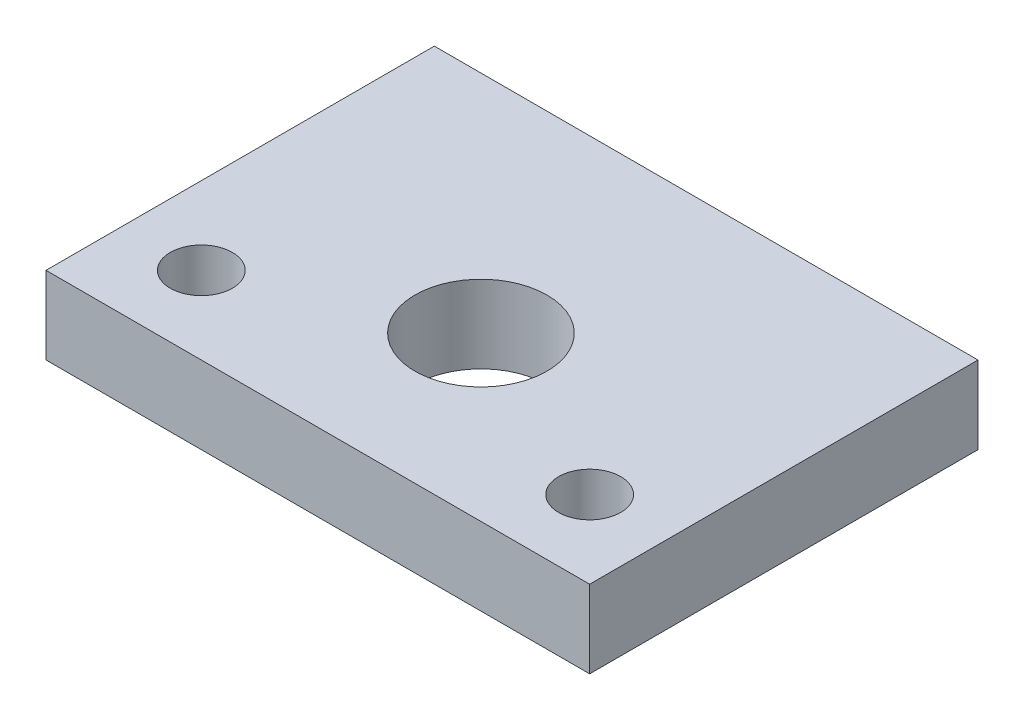
ISO-10303-21;
HEADER;
FILE_DESCRIPTION(('STEP AP214'),'2;1');
FILE_NAME('part.step','',(''),(''),'','','');
FILE_SCHEMA(('AUTOMOTIVE_DESIGN { 1 0 10303 214 1 1 1 1 }'));
ENDSEC;
DATA;
#1=APPLICATION_CONTEXT('core data for automotive mechanical design processes');
#2=APPLICATION_PROTOCOL_DEFINITION('international standard','automotive_design',2000,#1);
#3=PRODUCT_CONTEXT('',#1,'mechanical');
#4=PRODUCT('Part','Part','',(#3));
#5=PRODUCT_RELATED_PRODUCT_CATEGORY('part','',(#4));
#6=PRODUCT_DEFINITION_FORMATION('','',#4);
#7=PRODUCT_DEFINITION_CONTEXT('part definition',#1,'design');
#8=PRODUCT_DEFINITION('design','',#6,#7);
#9=PRODUCT_DEFINITION_SHAPE('','',#8);
#10=(LENGTH_UNIT() NAMED_UNIT(*) SI_UNIT(.MILLI.,.METRE.));
#11=(NAMED_UNIT(*) PLANE_ANGLE_UNIT() SI_UNIT($,.RADIAN.));
#12=(NAMED_UNIT(*) SI_UNIT($,.STERADIAN.) SOLID_ANGLE_UNIT());
#13=UNCERTAINTY_MEASURE_WITH_UNIT(LENGTH_MEASURE(1.E-05),#10,'distance_accuracy_value','');
#14=(GEOMETRIC_REPRESENTATION_CONTEXT(3) GLOBAL_UNCERTAINTY_ASSIGNED_CONTEXT((#13)) GLOBAL_UNIT_ASSIGNED_CONTEXT((#10,
#11,#12)) REPRESENTATION_CONTEXT('',''));
#15=CARTESIAN_POINT('',(0.,0.,0.));
#16=DIRECTION('',(0.,0.,1.));
#17=DIRECTION('',(1.,0.,0.));
#18=AXIS2_PLACEMENT_3D('',#15,#16,#17);
#19=CARTESIAN_POINT('',(-35.,10.,25.));
#20=DIRECTION('',(1.,0.,0.));
#21=DIRECTION('',(0.,0.,-1.));
#22=AXIS2_PLACEMENT_3D('',#19,#20,#21);
#23=PLANE('',#22);
#24=DIRECTION('',(0.,0.,1.));
#25=VECTOR('',#24,1.);
#26=CARTESIAN_POINT('',(-35.,0.,25.));
#27=LINE('',#26,#25);
#28=CARTESIAN_POINT('',(-35.,0.,-25.));
#29=VERTEX_POINT('',#28);
#30=CARTESIAN_POINT('',(-35.,0.,25.));
#31=VERTEX_POINT('',#30);
#32=EDGE_CURVE('E97',#29,#31,#27,.T.);
#33=ORIENTED_EDGE('',*,*,#32,.T.);
#34=DIRECTION('',(0.,-1.,0.));
#35=VECTOR('',#34,1.);
#36=CARTESIAN_POINT('',(-35.,10.,25.));
#37=LINE('',#36,#35);
#38=CARTESIAN_POINT('',(-35.,10.,25.));
#39=VERTEX_POINT('',#38);
#40=EDGE_CURVE('E11',#39,#31,#37,.T.);
#41=ORIENTED_EDGE('',*,*,#40,.F.);
#42=DIRECTION('',(0.,0.,1.));
#43=VECTOR('',#42,1.);
#44=CARTESIAN_POINT('',(-35.,10.,25.));
#45=LINE('',#44,#43);
#46=CARTESIAN_POINT('',(-35.,10.,-25.));
#47=VERTEX_POINT('',#46);
#48=EDGE_CURVE('E85',#47,#39,#45,.T.);
#49=ORIENTED_EDGE('',*,*,#48,.F.);
#50=DIRECTION('',(0.,-1.,0.));
#51=VECTOR('',#50,1.);
#52=CARTESIAN_POINT('',(-35.,10.,-25.));
#53=LINE('',#52,#51);
#54=EDGE_CURVE('E93',#47,#29,#53,.T.);
#55=ORIENTED_EDGE('',*,*,#54,.T.);
#56=EDGE_LOOP('',(#33,#41,#49,#55));
#57=FACE_BOUND('',#56,.T.);
#58=ADVANCED_FACE('F34',(#57),#23,.F.);
#59=CARTESIAN_POINT('',(35.,10.,25.));
#60=DIRECTION('',(0.,0.,-1.));
#61=DIRECTION('',(-1.,0.,0.));
#62=AXIS2_PLACEMENT_3D('',#59,#60,#61);
#63=PLANE('',#62);
#64=DIRECTION('',(1.,0.,0.));
#65=VECTOR('',#64,1.);
#66=CARTESIAN_POINT('',(35.,0.,25.));
#67=LINE('',#66,#65);
#68=CARTESIAN_POINT('',(35.,0.,25.));
#69=VERTEX_POINT('',#68);
#70=EDGE_CURVE('E89',#31,#69,#67,.T.);
#71=ORIENTED_EDGE('',*,*,#70,.T.);
#72=DIRECTION('',(0.,-1.,0.));
#73=VECTOR('',#72,1.);
#74=CARTESIAN_POINT('',(35.,10.,25.));
#75=LINE('',#74,#73);
#76=CARTESIAN_POINT('',(35.,10.,25.));
#77=VERTEX_POINT('',#76);
#78=EDGE_CURVE('E42',#77,#69,#75,.T.);
#79=ORIENTED_EDGE('',*,*,#78,.F.);
#80=DIRECTION('',(1.,0.,0.));
#81=VECTOR('',#80,1.);
#82=CARTESIAN_POINT('',(35.,10.,25.));
#83=LINE('',#82,#81);
#84=EDGE_CURVE('E80',#39,#77,#83,.T.);
#85=ORIENTED_EDGE('',*,*,#84,.F.);
#86=ORIENTED_EDGE('',*,*,#40,.T.);
#87=EDGE_LOOP('',(#71,#79,#85,#86));
#88=FACE_BOUND('',#87,.T.);
#89=ADVANCED_FACE('F88',(#88),#63,.F.);
#90=CARTESIAN_POINT('',(35.,10.,25.));
#91=DIRECTION('',(-1.,0.,0.));
#92=DIRECTION('',(0.,0.,1.));
#93=AXIS2_PLACEMENT_3D('',#90,#91,#92);
#94=PLANE('',#93);
#95=DIRECTION('',(0.,0.,-1.));
#96=VECTOR('',#95,1.);
#97=CARTESIAN_POINT('',(35.,0.,25.));
#98=LINE('',#97,#96);
#99=CARTESIAN_POINT('',(35.,0.,-25.));
#100=VERTEX_POINT('',#99);
#101=EDGE_CURVE('E67',#69,#100,#98,.T.);
#102=ORIENTED_EDGE('',*,*,#101,.T.);
#103=DIRECTION('',(0.,-1.,0.));
#104=VECTOR('',#103,1.);
#105=CARTESIAN_POINT('',(35.,10.,-25.));
#106=LINE('',#105,#104);
#107=CARTESIAN_POINT('',(35.,10.,-25.));
#108=VERTEX_POINT('',#107);
#109=EDGE_CURVE('E90',#108,#100,#106,.T.);
#110=ORIENTED_EDGE('',*,*,#109,.F.);
#111=DIRECTION('',(0.,0.,-1.));
#112=VECTOR('',#111,1.);
#113=CARTESIAN_POINT('',(35.,10.,25.));
#114=LINE('',#113,#112);
#115=EDGE_CURVE('E83',#77,#108,#114,.T.);
#116=ORIENTED_EDGE('',*,*,#115,.F.);
#117=ORIENTED_EDGE('',*,*,#78,.T.);
#118=EDGE_LOOP('',(#102,#110,#116,#117));
#119=FACE_BOUND('',#118,.T.);
#120=ADVANCED_FACE('F91',(#119),#94,.F.);
#121=CARTESIAN_POINT('',(35.,10.,-25.));
#122=DIRECTION('',(0.,0.,1.));
#123=DIRECTION('',(1.,0.,0.));
#124=AXIS2_PLACEMENT_3D('',#121,#122,#123);
#125=PLANE('',#124);
#126=DIRECTION('',(-1.,0.,0.));
#127=VECTOR('',#126,1.);
#128=CARTESIAN_POINT('',(35.,0.,-25.));
#129=LINE('',#128,#127);
#130=EDGE_CURVE('E73',#100,#29,#129,.T.);
#131=ORIENTED_EDGE('',*,*,#130,.T.);
#132=ORIENTED_EDGE('',*,*,#54,.F.);
#133=DIRECTION('',(-1.,0.,0.));
#134=VECTOR('',#133,1.);
#135=CARTESIAN_POINT('',(35.,10.,-25.));
#136=LINE('',#135,#134);
#137=EDGE_CURVE('E50',#108,#47,#136,.T.);
#138=ORIENTED_EDGE('',*,*,#137,.F.);
#139=ORIENTED_EDGE('',*,*,#109,.T.);
#140=EDGE_LOOP('',(#131,#132,#138,#139));
#141=FACE_BOUND('',#140,.T.);
#142=ADVANCED_FACE('F105',(#141),#125,.F.);
#143=CARTESIAN_POINT('',(0.,10.,0.));
#144=DIRECTION('',(0.,1.,0.));
#145=DIRECTION('',(0.,0.,1.));
#146=AXIS2_PLACEMENT_3D('',#143,#144,#145);
#147=PLANE('',#146);
#148=CARTESIAN_POINT('',(5.15281762734335E-13,10.,4.));
#149=DIRECTION('',(0.,-1.,0.));
#150=DIRECTION('',(0.,0.,-1.));
#151=AXIS2_PLACEMENT_3D('',#148,#149,#150);
#152=CIRCLE('',#151,8.50000000000002);
#153=CARTESIAN_POINT('',(5.15281762734335E-13,10.,-4.50000000000001));
#154=VERTEX_POINT('',#153);
#155=EDGE_CURVE('E115',#154,#154,#152,.T.);
#156=ORIENTED_EDGE('',*,*,#155,.T.);
#157=EDGE_LOOP('',(#156));
#158=FACE_BOUND('',#157,.T.);
#159=CARTESIAN_POINT('',(-25.,10.,15.));
#160=DIRECTION('',(0.,-1.,0.));
#161=DIRECTION('',(0.,0.,-1.));
#162=AXIS2_PLACEMENT_3D('',#159,#160,#161);
#163=CIRCLE('',#162,4.);
#164=CARTESIAN_POINT('',(-25.,10.,11.));
#165=VERTEX_POINT('',#164);
#166=EDGE_CURVE('E100',#165,#165,#163,.T.);
#167=ORIENTED_EDGE('',*,*,#166,.T.);
#168=EDGE_LOOP('',(#167));
#169=FACE_BOUND('',#168,.T.);
#170=CARTESIAN_POINT('',(25.,10.,15.));
#171=DIRECTION('',(0.,-1.,0.));
#172=DIRECTION('',(0.,0.,1.));
#173=AXIS2_PLACEMENT_3D('',#170,#171,#172);
#174=CIRCLE('',#173,4.);
#175=CARTESIAN_POINT('',(25.,10.,19.));
#176=VERTEX_POINT('',#175);
#177=EDGE_CURVE('E114',#176,#176,#174,.T.);
#178=ORIENTED_EDGE('',*,*,#177,.T.);
#179=EDGE_LOOP('',(#178));
#180=FACE_BOUND('',#179,.T.);
#181=ORIENTED_EDGE('',*,*,#48,.T.);
#182=ORIENTED_EDGE('',*,*,#84,.T.);
#183=ORIENTED_EDGE('',*,*,#115,.T.);
#184=ORIENTED_EDGE('',*,*,#137,.T.);
#185=EDGE_LOOP('',(#181,#182,#183,#184));
#186=FACE_BOUND('',#185,.T.);
#187=ADVANCED_FACE('F81',(#158,#169,#180,#186),#147,.T.);
#188=CARTESIAN_POINT('',(0.,0.,0.));
#189=DIRECTION('',(0.,1.,0.));
#190=DIRECTION('',(0.,0.,1.));
#191=AXIS2_PLACEMENT_3D('',#188,#189,#190);
#192=PLANE('',#191);
#193=CARTESIAN_POINT('',(5.15281762734335E-13,0.,4.));
#194=DIRECTION('',(0.,-1.,0.));
#195=DIRECTION('',(0.,0.,-1.));
#196=AXIS2_PLACEMENT_3D('',#193,#194,#195);
#197=CIRCLE('',#196,8.50000000000002);
#198=CARTESIAN_POINT('',(5.15281762734335E-13,0.,-4.50000000000001));
#199=VERTEX_POINT('',#198);
#200=EDGE_CURVE('E123',#199,#199,#197,.T.);
#201=ORIENTED_EDGE('',*,*,#200,.F.);
#202=EDGE_LOOP('',(#201));
#203=FACE_BOUND('',#202,.T.);
#204=CARTESIAN_POINT('',(-25.,0.,15.));
#205=DIRECTION('',(0.,-1.,0.));
#206=DIRECTION('',(0.,0.,-1.));
#207=AXIS2_PLACEMENT_3D('',#204,#205,#206);
#208=CIRCLE('',#207,4.);
#209=CARTESIAN_POINT('',(-25.,0.,11.));
#210=VERTEX_POINT('',#209);
#211=EDGE_CURVE('E118',#210,#210,#208,.T.);
#212=ORIENTED_EDGE('',*,*,#211,.F.);
#213=EDGE_LOOP('',(#212));
#214=FACE_BOUND('',#213,.T.);
#215=CARTESIAN_POINT('',(25.,0.,15.));
#216=DIRECTION('',(0.,-1.,0.));
#217=DIRECTION('',(0.,0.,1.));
#218=AXIS2_PLACEMENT_3D('',#215,#216,#217);
#219=CIRCLE('',#218,4.);
#220=CARTESIAN_POINT('',(25.,0.,19.));
#221=VERTEX_POINT('',#220);
#222=EDGE_CURVE('E111',#221,#221,#219,.T.);
#223=ORIENTED_EDGE('',*,*,#222,.F.);
#224=EDGE_LOOP('',(#223));
#225=FACE_BOUND('',#224,.T.);
#226=ORIENTED_EDGE('',*,*,#32,.F.);
#227=ORIENTED_EDGE('',*,*,#130,.F.);
#228=ORIENTED_EDGE('',*,*,#101,.F.);
#229=ORIENTED_EDGE('',*,*,#70,.F.);
#230=EDGE_LOOP('',(#226,#227,#228,#229));
#231=FACE_BOUND('',#230,.T.);
#232=ADVANCED_FACE('F108',(#203,#214,#225,#231),#192,.F.);
#233=CARTESIAN_POINT('',(25.,10.,15.));
#234=DIRECTION('',(0.,-1.,0.));
#235=DIRECTION('',(0.,0.,-1.));
#236=AXIS2_PLACEMENT_3D('',#233,#234,#235);
#237=CYLINDRICAL_SURFACE('',#236,4.);
#238=ORIENTED_EDGE('',*,*,#177,.F.);
#239=EDGE_LOOP('',(#238));
#240=FACE_BOUND('',#239,.T.);
#241=ORIENTED_EDGE('',*,*,#222,.T.);
#242=EDGE_LOOP('',(#241));
#243=FACE_BOUND('',#242,.T.);
#244=ADVANCED_FACE('F140',(#240,#243),#237,.F.);
#245=CARTESIAN_POINT('',(-25.,10.,15.));
#246=DIRECTION('',(0.,-1.,0.));
#247=DIRECTION('',(0.,0.,-1.));
#248=AXIS2_PLACEMENT_3D('',#245,#246,#247);
#249=CYLINDRICAL_SURFACE('',#248,4.);
#250=ORIENTED_EDGE('',*,*,#166,.F.);
#251=EDGE_LOOP('',(#250));
#252=FACE_BOUND('',#251,.T.);
#253=ORIENTED_EDGE('',*,*,#211,.T.);
#254=EDGE_LOOP('',(#253));
#255=FACE_BOUND('',#254,.T.);
#256=ADVANCED_FACE('F134',(#252,#255),#249,.F.);
#257=CARTESIAN_POINT('',(5.15281762734335E-13,10.,4.));
#258=DIRECTION('',(0.,-1.,0.));
#259=DIRECTION('',(0.,0.,-1.));
#260=AXIS2_PLACEMENT_3D('',#257,#258,#259);
#261=CYLINDRICAL_SURFACE('',#260,8.50000000000002);
#262=ORIENTED_EDGE('',*,*,#155,.F.);
#263=EDGE_LOOP('',(#262));
#264=FACE_BOUND('',#263,.T.);
#265=ORIENTED_EDGE('',*,*,#200,.T.);
#266=EDGE_LOOP('',(#265));
#267=FACE_BOUND('',#266,.T.);
#268=ADVANCED_FACE('F131',(#264,#267),#261,.F.);
#269=CLOSED_SHELL('',(#58,#89,#120,#142,#187,#232,#244,#256,#268));
#270=MANIFOLD_SOLID_BREP('B2',#269);
#271=ADVANCED_BREP_SHAPE_REPRESENTATION('',(#18,#270),#14);
#272=SHAPE_DEFINITION_REPRESENTATION(#9,#271);
ENDSEC;
END-ISO-10303-21;
